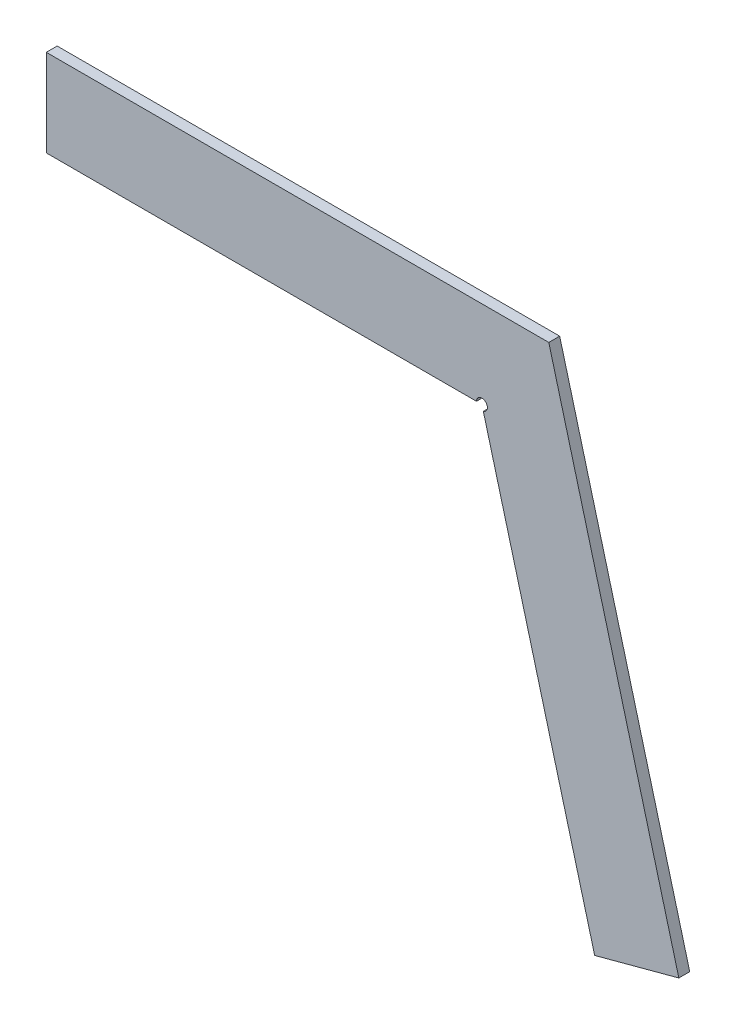
ISO-10303-21;
HEADER;
FILE_DESCRIPTION(('STEP AP214'),'2;1');
FILE_NAME('part.step','',(''),(''),'','','');
FILE_SCHEMA(('AUTOMOTIVE_DESIGN { 1 0 10303 214 1 1 1 1 }'));
ENDSEC;
DATA;
#1=APPLICATION_CONTEXT('core data for automotive mechanical design processes');
#2=APPLICATION_PROTOCOL_DEFINITION('international standard','automotive_design',2000,#1);
#3=PRODUCT_CONTEXT('',#1,'mechanical');
#4=PRODUCT('Part','Part','',(#3));
#5=PRODUCT_RELATED_PRODUCT_CATEGORY('part','',(#4));
#6=PRODUCT_DEFINITION_FORMATION('','',#4);
#7=PRODUCT_DEFINITION_CONTEXT('part definition',#1,'design');
#8=PRODUCT_DEFINITION('design','',#6,#7);
#9=PRODUCT_DEFINITION_SHAPE('','',#8);
#10=(LENGTH_UNIT() NAMED_UNIT(*) SI_UNIT(.MILLI.,.METRE.));
#11=(NAMED_UNIT(*) PLANE_ANGLE_UNIT() SI_UNIT($,.RADIAN.));
#12=(NAMED_UNIT(*) SI_UNIT($,.STERADIAN.) SOLID_ANGLE_UNIT());
#13=UNCERTAINTY_MEASURE_WITH_UNIT(LENGTH_MEASURE(1.E-05),#10,'distance_accuracy_value','');
#14=(GEOMETRIC_REPRESENTATION_CONTEXT(3) GLOBAL_UNCERTAINTY_ASSIGNED_CONTEXT((#13)) GLOBAL_UNIT_ASSIGNED_CONTEXT((#10,
#11,#12)) REPRESENTATION_CONTEXT('',''));
#15=CARTESIAN_POINT('',(0.,0.,0.));
#16=DIRECTION('',(0.,0.,1.));
#17=DIRECTION('',(1.,0.,0.));
#18=AXIS2_PLACEMENT_3D('',#15,#16,#17);
#19=CARTESIAN_POINT('',(230.693079519159,0.,5.));
#20=DIRECTION('',(0.,-1.,0.));
#21=DIRECTION('',(1.,0.,0.));
#22=AXIS2_PLACEMENT_3D('',#19,#20,#21);
#23=PLANE('',#22);
#24=DIRECTION('',(-1.,0.,0.));
#25=VECTOR('',#24,1.);
#26=CARTESIAN_POINT('',(230.693079519159,0.,0.));
#27=LINE('',#26,#25);
#28=CARTESIAN_POINT('',(230.693079519159,0.,0.));
#29=VERTEX_POINT('',#28);
#30=CARTESIAN_POINT('',(0.,0.,0.));
#31=VERTEX_POINT('',#30);
#32=EDGE_CURVE('E123',#29,#31,#27,.T.);
#33=ORIENTED_EDGE('',*,*,#32,.T.);
#34=DIRECTION('',(0.,0.,-1.));
#35=VECTOR('',#34,1.);
#36=CARTESIAN_POINT('',(0.,0.,5.));
#37=LINE('',#36,#35);
#38=CARTESIAN_POINT('',(0.,0.,5.));
#39=VERTEX_POINT('',#38);
#40=EDGE_CURVE('E40',#39,#31,#37,.T.);
#41=ORIENTED_EDGE('',*,*,#40,.F.);
#42=DIRECTION('',(-1.,0.,0.));
#43=VECTOR('',#42,1.);
#44=CARTESIAN_POINT('',(230.693079519159,0.,5.));
#45=LINE('',#44,#43);
#46=CARTESIAN_POINT('',(230.693079519159,0.,5.));
#47=VERTEX_POINT('',#46);
#48=EDGE_CURVE('E135',#47,#39,#45,.T.);
#49=ORIENTED_EDGE('',*,*,#48,.F.);
#50=DIRECTION('',(0.,0.,-1.));
#51=VECTOR('',#50,1.);
#52=CARTESIAN_POINT('',(230.693079519159,0.,5.));
#53=LINE('',#52,#51);
#54=EDGE_CURVE('E119',#47,#29,#53,.T.);
#55=ORIENTED_EDGE('',*,*,#54,.T.);
#56=EDGE_LOOP('',(#33,#41,#49,#55));
#57=FACE_BOUND('',#56,.T.);
#58=ADVANCED_FACE('F33',(#57),#23,.F.);
#59=CARTESIAN_POINT('',(0.,0.,5.));
#60=DIRECTION('',(1.,0.,0.));
#61=DIRECTION('',(0.,1.,0.));
#62=AXIS2_PLACEMENT_3D('',#59,#60,#61);
#63=PLANE('',#62);
#64=DIRECTION('',(0.,-1.,0.));
#65=VECTOR('',#64,1.);
#66=CARTESIAN_POINT('',(0.,0.,0.));
#67=LINE('',#66,#65);
#68=CARTESIAN_POINT('',(0.,-40.,0.));
#69=VERTEX_POINT('',#68);
#70=EDGE_CURVE('E126',#31,#69,#67,.T.);
#71=ORIENTED_EDGE('',*,*,#70,.T.);
#72=DIRECTION('',(0.,0.,-1.));
#73=VECTOR('',#72,1.);
#74=CARTESIAN_POINT('',(0.,-40.,5.));
#75=LINE('',#74,#73);
#76=CARTESIAN_POINT('',(0.,-40.,5.));
#77=VERTEX_POINT('',#76);
#78=EDGE_CURVE('E114',#77,#69,#75,.T.);
#79=ORIENTED_EDGE('',*,*,#78,.F.);
#80=DIRECTION('',(0.,-1.,0.));
#81=VECTOR('',#80,1.);
#82=CARTESIAN_POINT('',(0.,0.,5.));
#83=LINE('',#82,#81);
#84=EDGE_CURVE('E88',#39,#77,#83,.T.);
#85=ORIENTED_EDGE('',*,*,#84,.F.);
#86=ORIENTED_EDGE('',*,*,#40,.T.);
#87=EDGE_LOOP('',(#71,#79,#85,#86));
#88=FACE_BOUND('',#87,.T.);
#89=ADVANCED_FACE('F140',(#88),#63,.F.);
#90=CARTESIAN_POINT('',(0.,-40.,5.));
#91=DIRECTION('',(0.,1.,0.));
#92=DIRECTION('',(-1.,0.,0.));
#93=AXIS2_PLACEMENT_3D('',#90,#91,#92);
#94=PLANE('',#93);
#95=DIRECTION('',(1.,0.,0.));
#96=VECTOR('',#95,1.);
#97=CARTESIAN_POINT('',(0.,-40.,0.));
#98=LINE('',#97,#96);
#99=CARTESIAN_POINT('',(197.5,-40.,0.));
#100=VERTEX_POINT('',#99);
#101=EDGE_CURVE('E128',#69,#100,#98,.T.);
#102=ORIENTED_EDGE('',*,*,#101,.T.);
#103=DIRECTION('',(0.,0.,1.));
#104=VECTOR('',#103,1.);
#105=CARTESIAN_POINT('',(197.5,-40.,0.));
#106=LINE('',#105,#104);
#107=CARTESIAN_POINT('',(197.5,-40.,5.));
#108=VERTEX_POINT('',#107);
#109=EDGE_CURVE('E47',#100,#108,#106,.T.);
#110=ORIENTED_EDGE('',*,*,#109,.T.);
#111=DIRECTION('',(1.,0.,0.));
#112=VECTOR('',#111,1.);
#113=CARTESIAN_POINT('',(0.,-40.,5.));
#114=LINE('',#113,#112);
#115=EDGE_CURVE('E105',#77,#108,#114,.T.);
#116=ORIENTED_EDGE('',*,*,#115,.F.);
#117=ORIENTED_EDGE('',*,*,#78,.T.);
#118=EDGE_LOOP('',(#102,#110,#116,#117));
#119=FACE_BOUND('',#118,.T.);
#120=ADVANCED_FACE('F148',(#119),#94,.F.);
#121=CARTESIAN_POINT('',(200.,-40.,5.));
#122=DIRECTION('',(0.965925826289069,0.258819045102518,0.));
#123=DIRECTION('',(-0.258819045102518,0.965925826289069,0.));
#124=AXIS2_PLACEMENT_3D('',#121,#122,#123);
#125=PLANE('',#124);
#126=DIRECTION('',(0.258819045102518,-0.965925826289069,0.));
#127=VECTOR('',#126,1.);
#128=CARTESIAN_POINT('',(200.,-40.,5.));
#129=LINE('',#128,#127);
#130=CARTESIAN_POINT('',(200.647047612756,-42.4148145657226,5.));
#131=VERTEX_POINT('',#130);
#132=CARTESIAN_POINT('',(251.763809020504,-233.185165257814,5.));
#133=VERTEX_POINT('',#132);
#134=EDGE_CURVE('E95',#131,#133,#129,.T.);
#135=ORIENTED_EDGE('',*,*,#134,.F.);
#136=DIRECTION('',(0.,0.,1.));
#137=VECTOR('',#136,1.);
#138=CARTESIAN_POINT('',(200.647047612756,-42.4148145657226,0.));
#139=LINE('',#138,#137);
#140=CARTESIAN_POINT('',(200.647047612756,-42.4148145657226,0.));
#141=VERTEX_POINT('',#140);
#142=EDGE_CURVE('E155',#131,#141,#139,.F.);
#143=ORIENTED_EDGE('',*,*,#142,.T.);
#144=DIRECTION('',(0.258819045102518,-0.965925826289069,0.));
#145=VECTOR('',#144,1.);
#146=CARTESIAN_POINT('',(200.,-40.,0.));
#147=LINE('',#146,#145);
#148=CARTESIAN_POINT('',(251.763809020504,-233.185165257814,0.));
#149=VERTEX_POINT('',#148);
#150=EDGE_CURVE('E111',#141,#149,#147,.T.);
#151=ORIENTED_EDGE('',*,*,#150,.T.);
#152=DIRECTION('',(0.,0.,-1.));
#153=VECTOR('',#152,1.);
#154=CARTESIAN_POINT('',(251.763809020504,-233.185165257814,5.));
#155=LINE('',#154,#153);
#156=EDGE_CURVE('E108',#133,#149,#155,.T.);
#157=ORIENTED_EDGE('',*,*,#156,.F.);
#158=EDGE_LOOP('',(#135,#143,#151,#157));
#159=FACE_BOUND('',#158,.T.);
#160=ADVANCED_FACE('F109',(#159),#125,.F.);
#161=CARTESIAN_POINT('',(251.763809020504,-233.185165257814,5.));
#162=DIRECTION('',(-0.258819045102518,0.965925826289069,0.));
#163=DIRECTION('',(-0.965925826289069,-0.258819045102518,0.));
#164=AXIS2_PLACEMENT_3D('',#161,#162,#163);
#165=PLANE('',#164);
#166=DIRECTION('',(0.965925826289069,0.258819045102518,0.));
#167=VECTOR('',#166,1.);
#168=CARTESIAN_POINT('',(251.763809020504,-233.185165257814,0.));
#169=LINE('',#168,#167);
#170=CARTESIAN_POINT('',(290.400842072066,-222.832403453713,0.));
#171=VERTEX_POINT('',#170);
#172=EDGE_CURVE('E132',#149,#171,#169,.T.);
#173=ORIENTED_EDGE('',*,*,#172,.T.);
#174=DIRECTION('',(0.,0.,-1.));
#175=VECTOR('',#174,1.);
#176=CARTESIAN_POINT('',(290.400842072066,-222.832403453713,5.));
#177=LINE('',#176,#175);
#178=CARTESIAN_POINT('',(290.400842072066,-222.832403453713,5.));
#179=VERTEX_POINT('',#178);
#180=EDGE_CURVE('E115',#179,#171,#177,.T.);
#181=ORIENTED_EDGE('',*,*,#180,.F.);
#182=DIRECTION('',(0.965925826289069,0.258819045102518,0.));
#183=VECTOR('',#182,1.);
#184=CARTESIAN_POINT('',(251.763809020504,-233.185165257814,5.));
#185=LINE('',#184,#183);
#186=EDGE_CURVE('E99',#133,#179,#185,.T.);
#187=ORIENTED_EDGE('',*,*,#186,.F.);
#188=ORIENTED_EDGE('',*,*,#156,.T.);
#189=EDGE_LOOP('',(#173,#181,#187,#188));
#190=FACE_BOUND('',#189,.T.);
#191=ADVANCED_FACE('F117',(#190),#165,.F.);
#192=CARTESIAN_POINT('',(290.400842072066,-222.832403453713,5.));
#193=DIRECTION('',(-0.965925826289069,-0.258819045102518,0.));
#194=DIRECTION('',(0.258819045102518,-0.965925826289069,0.));
#195=AXIS2_PLACEMENT_3D('',#192,#193,#194);
#196=PLANE('',#195);
#197=DIRECTION('',(-0.258819045102518,0.965925826289069,0.));
#198=VECTOR('',#197,1.);
#199=CARTESIAN_POINT('',(290.400842072066,-222.832403453713,0.));
#200=LINE('',#199,#198);
#201=EDGE_CURVE('E79',#171,#29,#200,.T.);
#202=ORIENTED_EDGE('',*,*,#201,.T.);
#203=ORIENTED_EDGE('',*,*,#54,.F.);
#204=DIRECTION('',(-0.258819045102518,0.965925826289069,0.));
#205=VECTOR('',#204,1.);
#206=CARTESIAN_POINT('',(290.400842072066,-222.832403453713,5.));
#207=LINE('',#206,#205);
#208=EDGE_CURVE('E55',#179,#47,#207,.T.);
#209=ORIENTED_EDGE('',*,*,#208,.F.);
#210=ORIENTED_EDGE('',*,*,#180,.T.);
#211=EDGE_LOOP('',(#202,#203,#209,#210));
#212=FACE_BOUND('',#211,.T.);
#213=ADVANCED_FACE('F161',(#212),#196,.F.);
#214=CARTESIAN_POINT('',(0.,0.,5.));
#215=DIRECTION('',(0.,0.,1.));
#216=DIRECTION('',(1.,0.,0.));
#217=AXIS2_PLACEMENT_3D('',#214,#215,#216);
#218=PLANE('',#217);
#219=CARTESIAN_POINT('',(200.,-40.,5.));
#220=DIRECTION('',(0.,0.,1.));
#221=DIRECTION('',(1.,0.,0.));
#222=AXIS2_PLACEMENT_3D('',#219,#220,#221);
#223=CIRCLE('',#222,2.5);
#224=EDGE_CURVE('E102',#131,#108,#223,.T.);
#225=ORIENTED_EDGE('',*,*,#224,.F.);
#226=ORIENTED_EDGE('',*,*,#134,.T.);
#227=ORIENTED_EDGE('',*,*,#186,.T.);
#228=ORIENTED_EDGE('',*,*,#208,.T.);
#229=ORIENTED_EDGE('',*,*,#48,.T.);
#230=ORIENTED_EDGE('',*,*,#84,.T.);
#231=ORIENTED_EDGE('',*,*,#115,.T.);
#232=EDGE_LOOP('',(#225,#226,#227,#228,#229,#230,#231));
#233=FACE_BOUND('',#232,.T.);
#234=ADVANCED_FACE('F97',(#233),#218,.T.);
#235=CARTESIAN_POINT('',(0.,0.,0.));
#236=DIRECTION('',(0.,0.,1.));
#237=DIRECTION('',(1.,0.,0.));
#238=AXIS2_PLACEMENT_3D('',#235,#236,#237);
#239=PLANE('',#238);
#240=ORIENTED_EDGE('',*,*,#150,.F.);
#241=CARTESIAN_POINT('',(200.,-40.,0.));
#242=DIRECTION('',(0.,0.,1.));
#243=DIRECTION('',(1.,0.,0.));
#244=AXIS2_PLACEMENT_3D('',#241,#242,#243);
#245=CIRCLE('',#244,2.5);
#246=EDGE_CURVE('E11',#141,#100,#245,.T.);
#247=ORIENTED_EDGE('',*,*,#246,.T.);
#248=ORIENTED_EDGE('',*,*,#101,.F.);
#249=ORIENTED_EDGE('',*,*,#70,.F.);
#250=ORIENTED_EDGE('',*,*,#32,.F.);
#251=ORIENTED_EDGE('',*,*,#201,.F.);
#252=ORIENTED_EDGE('',*,*,#172,.F.);
#253=EDGE_LOOP('',(#240,#247,#248,#249,#250,#251,#252));
#254=FACE_BOUND('',#253,.T.);
#255=ADVANCED_FACE('F145',(#254),#239,.F.);
#256=CARTESIAN_POINT('',(200.,-40.,0.));
#257=DIRECTION('',(0.,0.,1.));
#258=DIRECTION('',(1.,0.,0.));
#259=AXIS2_PLACEMENT_3D('',#256,#257,#258);
#260=CYLINDRICAL_SURFACE('',#259,2.5);
#261=ORIENTED_EDGE('',*,*,#246,.F.);
#262=ORIENTED_EDGE('',*,*,#142,.F.);
#263=ORIENTED_EDGE('',*,*,#224,.T.);
#264=ORIENTED_EDGE('',*,*,#109,.F.);
#265=EDGE_LOOP('',(#261,#262,#263,#264));
#266=FACE_BOUND('',#265,.T.);
#267=ADVANCED_FACE('F158',(#266),#260,.F.);
#268=CLOSED_SHELL('',(#58,#89,#120,#160,#191,#213,#234,#255,#267));
#269=MANIFOLD_SOLID_BREP('B2',#268);
#270=ADVANCED_BREP_SHAPE_REPRESENTATION('',(#18,#269),#14);
#271=SHAPE_DEFINITION_REPRESENTATION(#9,#270);
ENDSEC;
END-ISO-10303-21;
